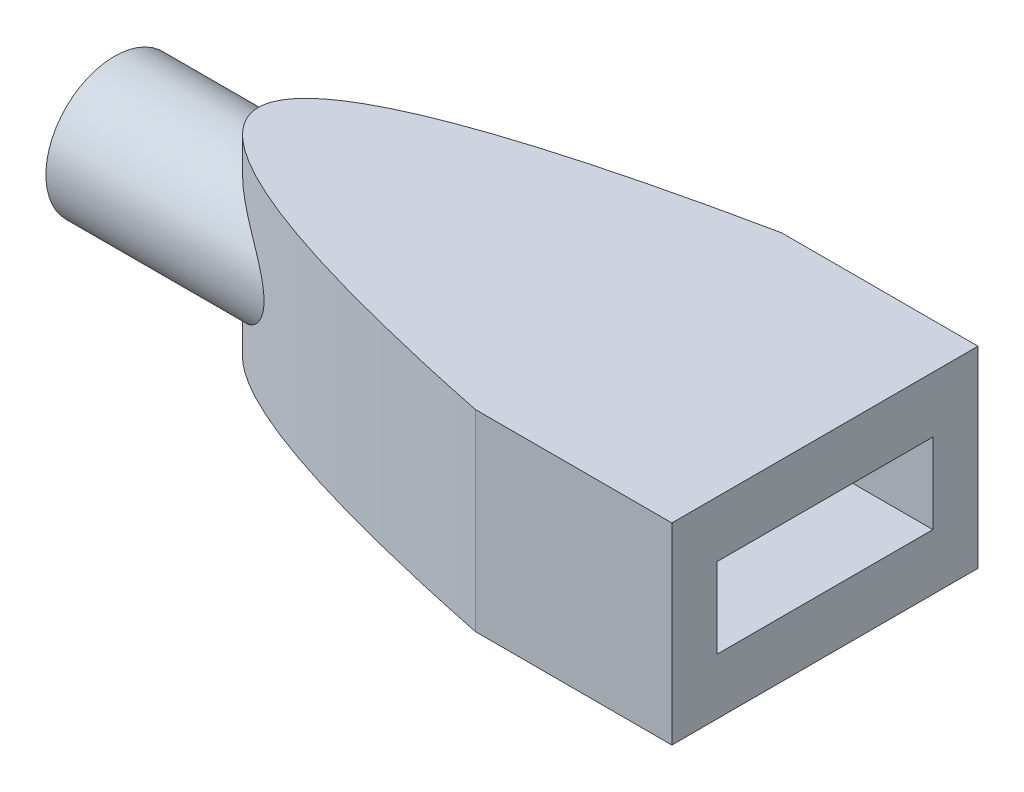
ISO-10303-21;
HEADER;
FILE_DESCRIPTION(('STEP AP214'),'2;1');
FILE_NAME('part.step','',(''),(''),'','','');
FILE_SCHEMA(('AUTOMOTIVE_DESIGN { 1 0 10303 214 1 1 1 1 }'));
ENDSEC;
DATA;
#1=APPLICATION_CONTEXT('core data for automotive mechanical design processes');
#2=APPLICATION_PROTOCOL_DEFINITION('international standard','automotive_design',2000,#1);
#3=PRODUCT_CONTEXT('',#1,'mechanical');
#4=PRODUCT('Part','Part','',(#3));
#5=PRODUCT_RELATED_PRODUCT_CATEGORY('part','',(#4));
#6=PRODUCT_DEFINITION_FORMATION('','',#4);
#7=PRODUCT_DEFINITION_CONTEXT('part definition',#1,'design');
#8=PRODUCT_DEFINITION('design','',#6,#7);
#9=PRODUCT_DEFINITION_SHAPE('','',#8);
#10=(LENGTH_UNIT() NAMED_UNIT(*) SI_UNIT(.MILLI.,.METRE.));
#11=(NAMED_UNIT(*) PLANE_ANGLE_UNIT() SI_UNIT($,.RADIAN.));
#12=(NAMED_UNIT(*) SI_UNIT($,.STERADIAN.) SOLID_ANGLE_UNIT());
#13=UNCERTAINTY_MEASURE_WITH_UNIT(LENGTH_MEASURE(1.E-05),#10,'distance_accuracy_value','');
#14=(GEOMETRIC_REPRESENTATION_CONTEXT(3) GLOBAL_UNCERTAINTY_ASSIGNED_CONTEXT((#13)) GLOBAL_UNIT_ASSIGNED_CONTEXT((#10,
#11,#12)) REPRESENTATION_CONTEXT('',''));
#15=CARTESIAN_POINT('',(0.,0.,0.));
#16=DIRECTION('',(0.,0.,1.));
#17=DIRECTION('',(1.,0.,0.));
#18=AXIS2_PLACEMENT_3D('',#15,#16,#17);
#19=CARTESIAN_POINT('',(5.461,5.3467,8.509));
#20=DIRECTION('',(-1.,0.,0.));
#21=DIRECTION('',(0.,0.,1.));
#22=AXIS2_PLACEMENT_3D('',#19,#20,#21);
#23=PLANE('',#22);
#24=DIRECTION('',(0.,0.,1.));
#25=VECTOR('',#24,1.);
#26=CARTESIAN_POINT('',(5.461,2.22885,6.00075));
#27=LINE('',#26,#25);
#28=CARTESIAN_POINT('',(5.461,2.22885,-6.00075));
#29=VERTEX_POINT('',#28);
#30=CARTESIAN_POINT('',(5.461,2.22885,6.00075));
#31=VERTEX_POINT('',#30);
#32=EDGE_CURVE('E143',#29,#31,#27,.T.);
#33=ORIENTED_EDGE('',*,*,#32,.F.);
#34=DIRECTION('',(0.,1.,0.));
#35=VECTOR('',#34,1.);
#36=CARTESIAN_POINT('',(5.461,-2.22885,-6.00075));
#37=LINE('',#36,#35);
#38=CARTESIAN_POINT('',(5.461,-2.22885,-6.00075));
#39=VERTEX_POINT('',#38);
#40=EDGE_CURVE('E59',#39,#29,#37,.T.);
#41=ORIENTED_EDGE('',*,*,#40,.F.);
#42=DIRECTION('',(0.,0.,-1.));
#43=VECTOR('',#42,1.);
#44=CARTESIAN_POINT('',(5.461,-2.22885,6.00075));
#45=LINE('',#44,#43);
#46=CARTESIAN_POINT('',(5.461,-2.22885,6.00075));
#47=VERTEX_POINT('',#46);
#48=EDGE_CURVE('E234',#47,#39,#45,.T.);
#49=ORIENTED_EDGE('',*,*,#48,.F.);
#50=DIRECTION('',(0.,-1.,0.));
#51=VECTOR('',#50,1.);
#52=CARTESIAN_POINT('',(5.461,-2.22885,6.00075));
#53=LINE('',#52,#51);
#54=EDGE_CURVE('E238',#31,#47,#53,.T.);
#55=ORIENTED_EDGE('',*,*,#54,.F.);
#56=EDGE_LOOP('',(#33,#41,#49,#55));
#57=FACE_BOUND('',#56,.T.);
#58=DIRECTION('',(0.,0.,-1.));
#59=VECTOR('',#58,1.);
#60=CARTESIAN_POINT('',(5.461,-5.3467,8.509));
#61=LINE('',#60,#59);
#62=CARTESIAN_POINT('',(5.461,-5.3467,8.509));
#63=VERTEX_POINT('',#62);
#64=CARTESIAN_POINT('',(5.461,-5.3467,-8.509));
#65=VERTEX_POINT('',#64);
#66=EDGE_CURVE('E123',#63,#65,#61,.T.);
#67=ORIENTED_EDGE('',*,*,#66,.T.);
#68=DIRECTION('',(0.,-1.,0.));
#69=VECTOR('',#68,1.);
#70=CARTESIAN_POINT('',(5.461,5.3467,-8.509));
#71=LINE('',#70,#69);
#72=CARTESIAN_POINT('',(5.461,5.3467,-8.509));
#73=VERTEX_POINT('',#72);
#74=EDGE_CURVE('E52',#73,#65,#71,.T.);
#75=ORIENTED_EDGE('',*,*,#74,.F.);
#76=DIRECTION('',(0.,0.,-1.));
#77=VECTOR('',#76,1.);
#78=CARTESIAN_POINT('',(5.461,5.3467,8.509));
#79=LINE('',#78,#77);
#80=CARTESIAN_POINT('',(5.461,5.3467,8.509));
#81=VERTEX_POINT('',#80);
#82=EDGE_CURVE('E125',#81,#73,#79,.T.);
#83=ORIENTED_EDGE('',*,*,#82,.F.);
#84=DIRECTION('',(0.,-1.,0.));
#85=VECTOR('',#84,1.);
#86=CARTESIAN_POINT('',(5.461,5.3467,8.509));
#87=LINE('',#86,#85);
#88=EDGE_CURVE('E135',#81,#63,#87,.T.);
#89=ORIENTED_EDGE('',*,*,#88,.T.);
#90=EDGE_LOOP('',(#67,#75,#83,#89));
#91=FACE_BOUND('',#90,.T.);
#92=ADVANCED_FACE('F39',(#57,#91),#23,.F.);
#93=CARTESIAN_POINT('',(-5.461,5.3467,-8.509));
#94=DIRECTION('',(0.,0.,1.));
#95=DIRECTION('',(1.,0.,0.));
#96=AXIS2_PLACEMENT_3D('',#93,#94,#95);
#97=PLANE('',#96);
#98=DIRECTION('',(-1.,0.,0.));
#99=VECTOR('',#98,1.);
#100=CARTESIAN_POINT('',(-5.461,-5.3467,-8.509));
#101=LINE('',#100,#99);
#102=CARTESIAN_POINT('',(-5.461,-5.3467,-8.509));
#103=VERTEX_POINT('',#102);
#104=EDGE_CURVE('E126',#65,#103,#101,.T.);
#105=ORIENTED_EDGE('',*,*,#104,.T.);
#106=DIRECTION('',(0.,-1.,0.));
#107=VECTOR('',#106,1.);
#108=CARTESIAN_POINT('',(-5.461,5.3467,-8.509));
#109=LINE('',#108,#107);
#110=CARTESIAN_POINT('',(-5.461,5.3467,-8.509));
#111=VERTEX_POINT('',#110);
#112=EDGE_CURVE('E134',#111,#103,#109,.T.);
#113=ORIENTED_EDGE('',*,*,#112,.F.);
#114=DIRECTION('',(-1.,0.,0.));
#115=VECTOR('',#114,1.);
#116=CARTESIAN_POINT('',(-5.461,5.3467,-8.509));
#117=LINE('',#116,#115);
#118=EDGE_CURVE('E94',#73,#111,#117,.T.);
#119=ORIENTED_EDGE('',*,*,#118,.F.);
#120=ORIENTED_EDGE('',*,*,#74,.T.);
#121=EDGE_LOOP('',(#105,#113,#119,#120));
#122=FACE_BOUND('',#121,.T.);
#123=ADVANCED_FACE('F197',(#122),#97,.F.);
#124=CARTESIAN_POINT('',(-5.461,5.3467,8.509));
#125=DIRECTION('',(0.,0.,-1.));
#126=DIRECTION('',(-1.,0.,0.));
#127=AXIS2_PLACEMENT_3D('',#124,#125,#126);
#128=PLANE('',#127);
#129=DIRECTION('',(1.,0.,0.));
#130=VECTOR('',#129,1.);
#131=CARTESIAN_POINT('',(-5.461,-5.3467,8.509));
#132=LINE('',#131,#130);
#133=CARTESIAN_POINT('',(-5.461,-5.3467,8.509));
#134=VERTEX_POINT('',#133);
#135=EDGE_CURVE('E86',#134,#63,#132,.T.);
#136=ORIENTED_EDGE('',*,*,#135,.T.);
#137=ORIENTED_EDGE('',*,*,#88,.F.);
#138=DIRECTION('',(1.,0.,0.));
#139=VECTOR('',#138,1.);
#140=CARTESIAN_POINT('',(-5.461,5.3467,8.509));
#141=LINE('',#140,#139);
#142=CARTESIAN_POINT('',(-5.461,5.3467,8.509));
#143=VERTEX_POINT('',#142);
#144=EDGE_CURVE('E68',#143,#81,#141,.T.);
#145=ORIENTED_EDGE('',*,*,#144,.F.);
#146=DIRECTION('',(0.,-1.,0.));
#147=VECTOR('',#146,1.);
#148=CARTESIAN_POINT('',(-5.461,5.3467,8.509));
#149=LINE('',#148,#147);
#150=EDGE_CURVE('E129',#143,#134,#149,.T.);
#151=ORIENTED_EDGE('',*,*,#150,.T.);
#152=EDGE_LOOP('',(#136,#137,#145,#151));
#153=FACE_BOUND('',#152,.T.);
#154=ADVANCED_FACE('F130',(#153),#128,.F.);
#155=CARTESIAN_POINT('',(0.,5.3467,0.));
#156=DIRECTION('',(0.,-1.,0.));
#157=DIRECTION('',(0.,0.,-1.));
#158=AXIS2_PLACEMENT_3D('',#155,#156,#157);
#159=PLANE('',#158);
#160=ORIENTED_EDGE('',*,*,#82,.T.);
#161=ORIENTED_EDGE('',*,*,#118,.T.);
#162=CARTESIAN_POINT('',(-5.461,5.3467,-8.509));
#163=CARTESIAN_POINT('',(-46.609,5.3467,0.));
#164=CARTESIAN_POINT('',(-5.461,5.3467,8.509));
#165=B_SPLINE_CURVE_WITH_KNOTS('',2,(#162,#163,#164),.UNSPECIFIED.,.F.,.F.,(3,3),(0.,1.),.UNSPECIFIED.);
#166=EDGE_CURVE('E139',#111,#143,#165,.T.);
#167=ORIENTED_EDGE('',*,*,#166,.T.);
#168=ORIENTED_EDGE('',*,*,#144,.T.);
#169=EDGE_LOOP('',(#160,#161,#167,#168));
#170=FACE_BOUND('',#169,.T.);
#171=ADVANCED_FACE('F191',(#170),#159,.F.);
#172=CARTESIAN_POINT('',(0.,-5.3467,0.));
#173=DIRECTION('',(0.,-1.,0.));
#174=DIRECTION('',(0.,0.,-1.));
#175=AXIS2_PLACEMENT_3D('',#172,#173,#174);
#176=PLANE('',#175);
#177=ORIENTED_EDGE('',*,*,#66,.F.);
#178=ORIENTED_EDGE('',*,*,#135,.F.);
#179=CARTESIAN_POINT('',(-5.461,-5.3467,-8.509));
#180=CARTESIAN_POINT('',(-46.609,-5.3467,0.));
#181=CARTESIAN_POINT('',(-5.461,-5.3467,8.509));
#182=B_SPLINE_CURVE_WITH_KNOTS('',2,(#179,#180,#181),.UNSPECIFIED.,.F.,.F.,(3,3),(0.,1.),.UNSPECIFIED.);
#183=EDGE_CURVE('E120',#103,#134,#182,.T.);
#184=ORIENTED_EDGE('',*,*,#183,.F.);
#185=ORIENTED_EDGE('',*,*,#104,.F.);
#186=EDGE_LOOP('',(#177,#178,#184,#185));
#187=FACE_BOUND('',#186,.T.);
#188=ADVANCED_FACE('F118',(#187),#176,.T.);
#189=CARTESIAN_POINT('',(-4.2926,-2.22885,-6.00075));
#190=DIRECTION('',(0.,0.,-1.));
#191=DIRECTION('',(-1.,0.,0.));
#192=AXIS2_PLACEMENT_3D('',#189,#190,#191);
#193=PLANE('',#192);
#194=ORIENTED_EDGE('',*,*,#40,.T.);
#195=DIRECTION('',(1.,0.,0.));
#196=VECTOR('',#195,1.);
#197=CARTESIAN_POINT('',(-4.2926,2.22885,-6.00075));
#198=LINE('',#197,#196);
#199=CARTESIAN_POINT('',(-4.2926,2.22885,-6.00075));
#200=VERTEX_POINT('',#199);
#201=EDGE_CURVE('E222',#200,#29,#198,.T.);
#202=ORIENTED_EDGE('',*,*,#201,.F.);
#203=DIRECTION('',(0.,1.,0.));
#204=VECTOR('',#203,1.);
#205=CARTESIAN_POINT('',(-4.2926,-2.22885,-6.00075));
#206=LINE('',#205,#204);
#207=CARTESIAN_POINT('',(-4.2926,-2.22885,-6.00075));
#208=VERTEX_POINT('',#207);
#209=EDGE_CURVE('E160',#208,#200,#206,.T.);
#210=ORIENTED_EDGE('',*,*,#209,.F.);
#211=DIRECTION('',(1.,0.,0.));
#212=VECTOR('',#211,1.);
#213=CARTESIAN_POINT('',(-4.2926,-2.22885,-6.00075));
#214=LINE('',#213,#212);
#215=EDGE_CURVE('E207',#208,#39,#214,.T.);
#216=ORIENTED_EDGE('',*,*,#215,.T.);
#217=EDGE_LOOP('',(#194,#202,#210,#216));
#218=FACE_BOUND('',#217,.T.);
#219=ADVANCED_FACE('F181',(#218),#193,.F.);
#220=CARTESIAN_POINT('',(-4.2926,-2.22885,6.00075));
#221=DIRECTION('',(0.,-1.,0.));
#222=DIRECTION('',(0.,0.,-1.));
#223=AXIS2_PLACEMENT_3D('',#220,#221,#222);
#224=PLANE('',#223);
#225=ORIENTED_EDGE('',*,*,#48,.T.);
#226=ORIENTED_EDGE('',*,*,#215,.F.);
#227=DIRECTION('',(0.,0.,-1.));
#228=VECTOR('',#227,1.);
#229=CARTESIAN_POINT('',(-4.2926,-2.22885,6.00075));
#230=LINE('',#229,#228);
#231=CARTESIAN_POINT('',(-4.2926,-2.22885,6.00075));
#232=VERTEX_POINT('',#231);
#233=EDGE_CURVE('E226',#232,#208,#230,.T.);
#234=ORIENTED_EDGE('',*,*,#233,.F.);
#235=DIRECTION('',(1.,0.,0.));
#236=VECTOR('',#235,1.);
#237=CARTESIAN_POINT('',(-4.2926,-2.22885,6.00075));
#238=LINE('',#237,#236);
#239=EDGE_CURVE('E229',#232,#47,#238,.T.);
#240=ORIENTED_EDGE('',*,*,#239,.T.);
#241=EDGE_LOOP('',(#225,#226,#234,#240));
#242=FACE_BOUND('',#241,.T.);
#243=ADVANCED_FACE('F177',(#242),#224,.F.);
#244=CARTESIAN_POINT('',(-4.2926,-2.22885,6.00075));
#245=DIRECTION('',(0.,0.,1.));
#246=DIRECTION('',(1.,0.,0.));
#247=AXIS2_PLACEMENT_3D('',#244,#245,#246);
#248=PLANE('',#247);
#249=ORIENTED_EDGE('',*,*,#54,.T.);
#250=ORIENTED_EDGE('',*,*,#239,.F.);
#251=DIRECTION('',(0.,-1.,0.));
#252=VECTOR('',#251,1.);
#253=CARTESIAN_POINT('',(-4.2926,-2.22885,6.00075));
#254=LINE('',#253,#252);
#255=CARTESIAN_POINT('',(-4.2926,2.22885,6.00075));
#256=VERTEX_POINT('',#255);
#257=EDGE_CURVE('E248',#256,#232,#254,.T.);
#258=ORIENTED_EDGE('',*,*,#257,.F.);
#259=DIRECTION('',(1.,0.,0.));
#260=VECTOR('',#259,1.);
#261=CARTESIAN_POINT('',(-4.2926,2.22885,6.00075));
#262=LINE('',#261,#260);
#263=EDGE_CURVE('E225',#256,#31,#262,.T.);
#264=ORIENTED_EDGE('',*,*,#263,.T.);
#265=EDGE_LOOP('',(#249,#250,#258,#264));
#266=FACE_BOUND('',#265,.T.);
#267=ADVANCED_FACE('F180',(#266),#248,.F.);
#268=CARTESIAN_POINT('',(-4.2926,2.22885,6.00075));
#269=DIRECTION('',(0.,1.,0.));
#270=DIRECTION('',(0.,0.,1.));
#271=AXIS2_PLACEMENT_3D('',#268,#269,#270);
#272=PLANE('',#271);
#273=ORIENTED_EDGE('',*,*,#32,.T.);
#274=ORIENTED_EDGE('',*,*,#263,.F.);
#275=DIRECTION('',(0.,0.,1.));
#276=VECTOR('',#275,1.);
#277=CARTESIAN_POINT('',(-4.2926,2.22885,6.00075));
#278=LINE('',#277,#276);
#279=EDGE_CURVE('E251',#200,#256,#278,.T.);
#280=ORIENTED_EDGE('',*,*,#279,.F.);
#281=ORIENTED_EDGE('',*,*,#201,.T.);
#282=EDGE_LOOP('',(#273,#274,#280,#281));
#283=FACE_BOUND('',#282,.T.);
#284=ADVANCED_FACE('F175',(#283),#272,.F.);
#285=CARTESIAN_POINT('',(-4.2926,0.,0.));
#286=DIRECTION('',(-1.,0.,0.));
#287=DIRECTION('',(0.,0.,1.));
#288=AXIS2_PLACEMENT_3D('',#285,#286,#287);
#289=PLANE('',#288);
#290=ORIENTED_EDGE('',*,*,#209,.T.);
#291=ORIENTED_EDGE('',*,*,#279,.T.);
#292=ORIENTED_EDGE('',*,*,#257,.T.);
#293=ORIENTED_EDGE('',*,*,#233,.T.);
#294=EDGE_LOOP('',(#290,#291,#292,#293));
#295=FACE_BOUND('',#294,.T.);
#296=ADVANCED_FACE('F169',(#295),#289,.F.);
#297=CARTESIAN_POINT('',(-5.461,-32.0469209728684,-8.509));
#298=CARTESIAN_POINT('',(-46.609,-32.0469209728684,0.));
#299=CARTESIAN_POINT('',(-5.461,-32.0469209728684,8.509));
#300=B_SPLINE_CURVE_WITH_KNOTS('',2,(#297,#298,#299),.UNSPECIFIED.,.F.,.F.,(3,3),(0.,1.),.UNSPECIFIED.);
#301=DIRECTION('',(0.,1.,0.));
#302=VECTOR('',#301,1.);
#303=SURFACE_OF_LINEAR_EXTRUSION('',#300,#302);
#304=CARTESIAN_POINT('',(-21.9101169525507,0.,-3.81));
#305=CARTESIAN_POINT('',(-21.9101162760935,-0.050344521565705,-3.8100002822212));
#306=CARTESIAN_POINT('',(-21.9122837770813,-0.100685125142597,-3.8089996784871));
#307=CARTESIAN_POINT('',(-21.9208761911947,-0.200939843045162,-3.80502832111581));
#308=CARTESIAN_POINT('',(-21.9273026504904,-0.250853795811463,-3.80205685197632));
#309=CARTESIAN_POINT('',(-21.944205700197,-0.349883565606855,-3.79422609603951));
#310=CARTESIAN_POINT('',(-21.9546861708058,-0.398998570868929,-3.78936500061052));
#311=CARTESIAN_POINT('',(-21.9793794796897,-0.496089670319657,-3.77788133097259));
#312=CARTESIAN_POINT('',(-21.9935944499687,-0.544065096814944,-3.77125775054349));
#313=CARTESIAN_POINT('',(-22.0299212272782,-0.652154866985758,-3.7542750973826));
#314=CARTESIAN_POINT('',(-22.0531288282878,-0.711818478397186,-3.74338945028756));
#315=CARTESIAN_POINT('',(-22.1042563539067,-0.828627806113224,-3.71927932520808));
#316=CARTESIAN_POINT('',(-22.1321801623835,-0.8857713978303,-3.70605291914051));
#317=CARTESIAN_POINT('',(-22.1919744139415,-0.997510106169924,-3.67755397618924));
#318=CARTESIAN_POINT('',(-22.2238501923162,-1.05210163753692,-3.66227867089477));
#319=CARTESIAN_POINT('',(-22.2908130283212,-1.15869185204907,-3.62996324413385));
#320=CARTESIAN_POINT('',(-22.3258993557662,-1.21069112062535,-3.61292352383848));
#321=CARTESIAN_POINT('',(-22.427332677773,-1.35218542988389,-3.56327779448679));
#322=CARTESIAN_POINT('',(-22.4965684897623,-1.43901633072767,-3.52896651181544));
#323=CARTESIAN_POINT('',(-22.6409015859383,-1.60583419468994,-3.45625254576965));
#324=CARTESIAN_POINT('',(-22.7160039338387,-1.68581511758729,-3.41784631716282));
#325=CARTESIAN_POINT('',(-22.8705478494639,-1.84007348424934,-3.33733759134451));
#326=CARTESIAN_POINT('',(-22.9500036744081,-1.9143300025693,-3.29522263669812));
#327=CARTESIAN_POINT('',(-23.1117506910859,-2.05763586194549,-3.20769110827921));
#328=CARTESIAN_POINT('',(-23.1940426533911,-2.12668377132512,-3.16227363344025));
#329=CARTESIAN_POINT('',(-23.383825041197,-2.27892987514588,-3.05508089397387));
#330=CARTESIAN_POINT('',(-23.4919116122629,-2.36066771794722,-2.99228954063655));
#331=CARTESIAN_POINT('',(-23.7096425327289,-2.51773114377772,-2.8613951572815));
#332=CARTESIAN_POINT('',(-23.8192880008465,-2.5930518192372,-2.79328813700018));
#333=CARTESIAN_POINT('',(-24.0388764996502,-2.73800828217595,-2.65136044766942));
#334=CARTESIAN_POINT('',(-24.148819728325,-2.80763732458862,-2.5775331957518));
#335=CARTESIAN_POINT('',(-24.3675757875864,-2.94153955996287,-2.42360319011055));
#336=CARTESIAN_POINT('',(-24.4763886690568,-3.00581299493521,-2.34350072027103));
#337=CARTESIAN_POINT('',(-24.6912964989779,-3.12908818158328,-2.17616603283626));
#338=CARTESIAN_POINT('',(-24.7973941926646,-3.18809542113442,-2.08894142313682));
#339=CARTESIAN_POINT('',(-25.0049524093434,-3.30066066276324,-1.90611107593211));
#340=CARTESIAN_POINT('',(-25.1064196597756,-3.35422671863168,-1.81051812719561));
#341=CARTESIAN_POINT('',(-25.2717596044297,-3.4396740709633,-1.64035762909191));
#342=CARTESIAN_POINT('',(-25.3375429431441,-3.47313328386464,-1.56844760309774));
#343=CARTESIAN_POINT('',(-25.4642856711012,-3.53676103655391,-1.41915705915763));
#344=CARTESIAN_POINT('',(-25.5252480546061,-3.56693162336179,-1.34177999421121));
#345=CARTESIAN_POINT('',(-25.6401479778817,-3.62316699410171,-1.18148819972146));
#346=CARTESIAN_POINT('',(-25.6941363657592,-3.64926182605026,-1.09862110893121));
#347=CARTESIAN_POINT('',(-25.7931627875131,-3.69670111943966,-0.926527879809284));
#348=CARTESIAN_POINT('',(-25.8382160560152,-3.71805367417844,-0.837312923993255));
#349=CARTESIAN_POINT('',(-25.9145837422646,-3.75401749466922,-0.656867746402445));
#350=CARTESIAN_POINT('',(-25.9464480742346,-3.76890028189092,-0.565933400561934));
#351=CARTESIAN_POINT('',(-25.9839988675125,-3.78637720581065,-0.426217485892037));
#352=CARTESIAN_POINT('',(-25.9948094174981,-3.79139553496074,-0.379082500380973));
#353=CARTESIAN_POINT('',(-26.0127267406945,-3.79970189572854,-0.283970892315849));
#354=CARTESIAN_POINT('',(-26.0198350913417,-3.80299066428485,-0.235994637232414));
#355=CARTESIAN_POINT('',(-26.0301605531215,-3.80776509135317,-0.139234522643702));
#356=CARTESIAN_POINT('',(-26.0333534523889,-3.80923953084116,-0.0904475103037804));
#357=CARTESIAN_POINT('',(-26.0356629364409,-3.81030619321603,0.00724318935845688));
#358=CARTESIAN_POINT('',(-26.0347796445414,-3.80989847304336,0.0561468731064111));
#359=CARTESIAN_POINT('',(-26.0289656546251,-3.80721236276947,0.153668557868589));
#360=CARTESIAN_POINT('',(-26.0240342046088,-3.80493362510167,0.202286504113071));
#361=CARTESIAN_POINT('',(-26.0102818928486,-3.7985685732481,0.298866487964077));
#362=CARTESIAN_POINT('',(-26.0014591110604,-3.79448136673211,0.346828189709231));
#363=CARTESIAN_POINT('',(-25.978579086557,-3.7838576083384,0.448929287407729));
#364=CARTESIAN_POINT('',(-25.9639326313883,-3.77704440853271,0.502908014433058));
#365=CARTESIAN_POINT('',(-25.9303402160591,-3.76136245656366,0.609216952992709));
#366=CARTESIAN_POINT('',(-25.9113913817624,-3.75249233021824,0.661546035773434));
#367=CARTESIAN_POINT('',(-25.8488822870251,-3.72310432739419,0.815813646815693));
#368=CARTESIAN_POINT('',(-25.7996749129881,-3.69981592503638,0.914968442352901));
#369=CARTESIAN_POINT('',(-25.700662297701,-3.65239197475384,1.08747193702961));
#370=CARTESIAN_POINT('',(-25.6526792292398,-3.62922400353855,1.16218516081856));
#371=CARTESIAN_POINT('',(-25.5512517956624,-3.57971067837156,1.30675403334819));
#372=CARTESIAN_POINT('',(-25.4978036297101,-3.55336311076461,1.37660624385205));
#373=CARTESIAN_POINT('',(-25.3866825067659,-3.49790539478754,1.51199419864569));
#374=CARTESIAN_POINT('',(-25.3289986825151,-3.46878807939107,1.5775179579745));
#375=CARTESIAN_POINT('',(-25.2105224835345,-3.40816019717608,1.70455187705475));
#376=CARTESIAN_POINT('',(-25.1497288835344,-3.37664868461897,1.76606043272508));
#377=CARTESIAN_POINT('',(-25.0238777713938,-3.3104283613515,1.8873496534668));
#378=CARTESIAN_POINT('',(-24.9587462917817,-3.27565016777049,1.94701515671872));
#379=CARTESIAN_POINT('',(-24.8266609503775,-3.20391239846032,2.0629310958078));
#380=CARTESIAN_POINT('',(-24.7597066960178,-3.16695235079434,2.11918078742491));
#381=CARTESIAN_POINT('',(-24.5567925148869,-3.0528442350621,2.28343607079223));
#382=CARTESIAN_POINT('',(-24.4188829130504,-2.97252107863323,2.38685266406815));
#383=CARTESIAN_POINT('',(-24.1411677130853,-2.80331591586629,2.58346996302735));
#384=CARTESIAN_POINT('',(-24.0013622899952,-2.71443469512113,2.67667160472227));
#385=CARTESIAN_POINT('',(-23.7225168073571,-2.52723103759514,2.85409148271779));
#386=CARTESIAN_POINT('',(-23.5834762285552,-2.42891614776898,2.93831678810108));
#387=CARTESIAN_POINT('',(-23.3738148317157,-2.27023445811238,3.06053851567699));
#388=CARTESIAN_POINT('',(-23.3019052436409,-2.21388475674422,3.10157537791655));
#389=CARTESIAN_POINT('',(-23.1595906074709,-2.09772941651424,3.18128887491722));
#390=CARTESIAN_POINT('',(-23.0891853133717,-2.03792434874198,3.21996589754326));
#391=CARTESIAN_POINT('',(-22.9505213438311,-1.91445901476471,3.29486838653523));
#392=CARTESIAN_POINT('',(-22.8822619140013,-1.85080012694458,3.33109471973024));
#393=CARTESIAN_POINT('',(-22.7486741147775,-1.71911309384183,3.40092723472376));
#394=CARTESIAN_POINT('',(-22.6833451429065,-1.65108585371267,3.43453395614973));
#395=CARTESIAN_POINT('',(-22.570716536588,-1.52570000564231,3.49170081548703));
#396=CARTESIAN_POINT('',(-22.5226282220049,-1.46931520807602,3.51583761365771));
#397=CARTESIAN_POINT('',(-22.4295271138368,-1.35323902343374,3.56212732071881));
#398=CARTESIAN_POINT('',(-22.3845151177236,-1.2935467861794,3.58427971565272));
#399=CARTESIAN_POINT('',(-22.2985125397071,-1.17071958618794,3.62625364041113));
#400=CARTESIAN_POINT('',(-22.2575137740709,-1.10759205598491,3.64607993072925));
#401=CARTESIAN_POINT('',(-22.1805046061489,-0.977631626873983,3.68305659345547));
#402=CARTESIAN_POINT('',(-22.1444930502246,-0.910799589915962,3.70020758482863));
#403=CARTESIAN_POINT('',(-22.0690857226914,-0.753193498436891,3.73591631406606));
#404=CARTESIAN_POINT('',(-22.0317773731591,-0.661131125460415,3.75341996002422));
#405=CARTESIAN_POINT('',(-21.9860487287416,-0.519098959222633,3.77477612512331));
#406=CARTESIAN_POINT('',(-21.9725129535002,-0.471107127293402,3.78107762836984));
#407=CARTESIAN_POINT('',(-21.949202163885,-0.374029605410818,3.79191015102387));
#408=CARTESIAN_POINT('',(-21.9394254399618,-0.324944423464179,3.79644197526444));
#409=CARTESIAN_POINT('',(-21.9238659718579,-0.225557358946293,3.80364670718959));
#410=CARTESIAN_POINT('',(-21.9181194113546,-0.175248547117379,3.80630277537696));
#411=CARTESIAN_POINT('',(-21.9109592882067,-0.0742557480185953,3.80961132647028));
#412=CARTESIAN_POINT('',(-21.9095456581985,-0.02357176659373,3.81026384052529));
#413=CARTESIAN_POINT('',(-21.9111048986047,0.0777245402996789,3.80954373425964));
#414=CARTESIAN_POINT('',(-21.9140785234247,0.128336851946287,3.80817076564939));
#415=CARTESIAN_POINT('',(-21.9242994971574,0.229019951028899,3.80344510190608));
#416=CARTESIAN_POINT('',(-21.9315467833806,0.279090746397341,3.80009243581287));
#417=CARTESIAN_POINT('',(-21.9574637106491,0.417761017651418,3.78807878791192));
#418=CARTESIAN_POINT('',(-21.9806337176163,0.50537033526637,3.77731665124831));
#419=CARTESIAN_POINT('',(-22.0378859821264,0.675983403852157,3.75055179716433));
#420=CARTESIAN_POINT('',(-22.0719735831041,0.758984876200783,3.73454651348515));
#421=CARTESIAN_POINT('',(-22.1769595562472,0.979071252914712,3.68483704814956));
#422=CARTESIAN_POINT('',(-22.2564967515207,1.11105718503504,3.64677155990559));
#423=CARTESIAN_POINT('',(-22.3877084152616,1.29792766823283,3.58271493863425));
#424=CARTESIAN_POINT('',(-22.433533849019,1.35847658868496,3.56015073237406));
#425=CARTESIAN_POINT('',(-22.5283652231319,1.47620007998657,3.5129679708256));
#426=CARTESIAN_POINT('',(-22.5773704494775,1.53337540289636,3.48834987637749));
#427=CARTESIAN_POINT('',(-22.7270908296028,1.69918870510417,3.41227135690812));
#428=CARTESIAN_POINT('',(-22.8314113214589,1.80334101975791,3.35815145250652));
#429=CARTESIAN_POINT('',(-23.0459757647671,2.00177119446252,3.24378167416173));
#430=CARTESIAN_POINT('',(-23.1562259032058,2.09603842570966,3.18352533653474));
#431=CARTESIAN_POINT('',(-23.3806796791537,2.27669228383869,3.05695752715095));
#432=CARTESIAN_POINT('',(-23.4948998986513,2.36303846971462,2.99061810371016));
#433=CARTESIAN_POINT('',(-23.7248903187703,2.52849774922606,2.85209303255539));
#434=CARTESIAN_POINT('',(-23.8406596965699,2.60761452052325,2.77991039297701));
#435=CARTESIAN_POINT('',(-24.0457982177585,2.74211869784209,2.64644735845393));
#436=CARTESIAN_POINT('',(-24.1351560495401,2.79879778103817,2.58644393994458));
#437=CARTESIAN_POINT('',(-24.313246126982,2.90860764891849,2.46231068480679));
#438=CARTESIAN_POINT('',(-24.4019781631353,2.96173729145421,2.398179532855));
#439=CARTESIAN_POINT('',(-24.5781151553494,3.06459518362934,2.26526521434794));
#440=CARTESIAN_POINT('',(-24.6655185410488,3.11431962003729,2.19647699867214));
#441=CARTESIAN_POINT('',(-24.8372971137487,3.20990083786133,2.05424482616227));
#442=CARTESIAN_POINT('',(-24.9216907059829,3.25578495331773,1.98084172474089));
#443=CARTESIAN_POINT('',(-25.0869094752133,3.34388411745552,1.8281959696326));
#444=CARTESIAN_POINT('',(-25.1677378655424,3.38610250475512,1.7489587536508));
#445=CARTESIAN_POINT('',(-25.3241805576844,3.4664426294552,1.58376163585209));
#446=CARTESIAN_POINT('',(-25.3998041454691,3.50457173426362,1.49781432312051));
#447=CARTESIAN_POINT('',(-25.5063821079012,3.55754268634946,1.36460866456238));
#448=CARTESIAN_POINT('',(-25.5401912863544,3.57422012245862,1.32035953430175));
#449=CARTESIAN_POINT('',(-25.6057283101674,3.6063395291503,1.22992732987669));
#450=CARTESIAN_POINT('',(-25.6374561797795,3.62178151412929,1.18374427825742));
#451=CARTESIAN_POINT('',(-25.7290020119223,3.66607625334267,1.04200858237917));
#452=CARTESIAN_POINT('',(-25.7851559404911,3.69288481898241,0.943301324102059));
#453=CARTESIAN_POINT('',(-25.8591957932495,3.7279429386339,0.788291240159787));
#454=CARTESIAN_POINT('',(-25.8823083949802,3.73883029978856,0.735045741486566));
#455=CARTESIAN_POINT('',(-25.9242849621131,3.75853342017061,0.62654790385147));
#456=CARTESIAN_POINT('',(-25.9431516499351,3.76735050698663,0.571296877352586));
#457=CARTESIAN_POINT('',(-25.9759835942724,3.78265394893993,0.459155806098011));
#458=CARTESIAN_POINT('',(-25.9899588708473,3.78914506947789,0.402269373411383));
#459=CARTESIAN_POINT('',(-26.0125006299028,3.79959851034666,0.287202077069643));
#460=CARTESIAN_POINT('',(-26.021068253042,3.80356136397705,0.229021489078234));
#461=CARTESIAN_POINT('',(-26.0318239424957,3.80853362329459,0.118032201859741));
#462=CARTESIAN_POINT('',(-26.0345800132796,3.80980602767899,0.0652900321235934));
#463=CARTESIAN_POINT('',(-26.0353307809954,3.81015277421513,-0.0402329456285952));
#464=CARTESIAN_POINT('',(-26.0333259012927,3.80922731181128,-0.0930137497918401));
#465=CARTESIAN_POINT('',(-26.0246297602138,3.80520820424344,-0.198142178338153));
#466=CARTESIAN_POINT('',(-26.0179348001439,3.80211284785515,-0.250489427821996));
#467=CARTESIAN_POINT('',(-26.0001048061072,3.79385231212325,-0.354252904734767));
#468=CARTESIAN_POINT('',(-25.9889692074237,3.78868686952605,-0.405669012880592));
#469=CARTESIAN_POINT('',(-25.9612114399945,3.77577443471953,-0.512674820788678));
#470=CARTESIAN_POINT('',(-25.9441277447695,3.76780942596648,-0.568118099642901));
#471=CARTESIAN_POINT('',(-25.9055638953194,3.74975678703698,-0.677112095638207));
#472=CARTESIAN_POINT('',(-25.8840807456944,3.73966771054189,-0.730661494031441));
#473=CARTESIAN_POINT('',(-25.8139343745537,3.70656458602364,-0.888260172979548));
#474=CARTESIAN_POINT('',(-25.7595873168964,3.68072065570243,-0.989213035256288));
#475=CARTESIAN_POINT('',(-25.6498377046736,3.62784213375888,-1.16707152161546));
#476=CARTESIAN_POINT('',(-25.5959954244556,3.60165970906208,-1.24524026121555));
#477=CARTESIAN_POINT('',(-25.4827033817188,3.54587946472247,-1.39617673570096));
#478=CARTESIAN_POINT('',(-25.423249445886,3.51627909948989,-1.4689403778713));
#479=CARTESIAN_POINT('',(-25.3000534528652,3.45408173540241,-1.609771999857));
#480=CARTESIAN_POINT('',(-25.2362985290695,3.42147562751046,-1.67782453353513));
#481=CARTESIAN_POINT('',(-25.1057274050268,3.35365427541475,-1.80958350101989));
#482=CARTESIAN_POINT('',(-25.0389100139457,3.31843801291595,-1.87328821980587));
#483=CARTESIAN_POINT('',(-24.9009076259017,3.24445163076451,-1.99877644690384));
#484=CARTESIAN_POINT('',(-24.829651330432,3.20560434386183,-2.06043549342979));
#485=CARTESIAN_POINT('',(-24.6854585388575,3.12545360202139,-2.18009575669932));
#486=CARTESIAN_POINT('',(-24.6125216973229,3.08414963931389,-2.2380962121092));
#487=CARTESIAN_POINT('',(-24.3919051774132,2.95652747701735,-2.40729774121127));
#488=CARTESIAN_POINT('',(-24.2425432319049,2.86656440370464,-2.51358975941895));
#489=CARTESIAN_POINT('',(-23.9432879942418,2.67657742352885,-2.71498354972463));
#490=CARTESIAN_POINT('',(-23.7933962983282,2.57657340408888,-2.81010666276808));
#491=CARTESIAN_POINT('',(-23.4961414651747,2.36488703439762,-2.99044233757285));
#492=CARTESIAN_POINT('',(-23.3487757556973,2.25321750098216,-3.07566556323986));
#493=CARTESIAN_POINT('',(-23.0873700983143,2.03771350242708,-3.221400228897));
#494=CARTESIAN_POINT('',(-22.9722546592948,1.93632382378151,-3.28355155095961));
#495=CARTESIAN_POINT('',(-22.8050623924462,1.77547554606053,-3.37157424847949));
#496=CARTESIAN_POINT('',(-22.7501987246887,1.72034583257886,-3.40007081100261));
#497=CARTESIAN_POINT('',(-22.6429070398095,1.60686885809926,-3.45514927297277));
#498=CARTESIAN_POINT('',(-22.5904784602762,1.54852234693497,-3.48173161531961));
#499=CARTESIAN_POINT('',(-22.4880152853035,1.42738451178086,-3.53313680813543));
#500=CARTESIAN_POINT('',(-22.4380253133764,1.3645417953652,-3.55792927669214));
#501=CARTESIAN_POINT('',(-22.342241701669,1.23488301478416,-3.6049884714468));
#502=CARTESIAN_POINT('',(-22.2964490932497,1.16806598067874,-3.62725457719396));
#503=CARTESIAN_POINT('',(-22.1674245950863,0.961426547064938,-3.68948507787125));
#504=CARTESIAN_POINT('',(-22.0920027688133,0.814809100623901,-3.72515093346494));
#505=CARTESIAN_POINT('',(-22.0143816800889,0.60800732772167,-3.76155061603154));
#506=CARTESIAN_POINT('',(-21.9967385774282,0.554762686250469,-3.76979001721418));
#507=CARTESIAN_POINT('',(-21.9659945631817,0.446713030666963,-3.78411270921872));
#508=CARTESIAN_POINT('',(-21.9528899778362,0.391909317637934,-3.79019774400884));
#509=CARTESIAN_POINT('',(-21.9317229337803,0.281232070486113,-3.80001178412593));
#510=CARTESIAN_POINT('',(-21.9236508838137,0.225360781855174,-3.80374527128967));
#511=CARTESIAN_POINT('',(-21.9128485953724,0.112991299960792,-3.80873907150642));
#512=CARTESIAN_POINT('',(-21.9101177116247,0.056493183254724,-3.80999968331064));
#513=CARTESIAN_POINT('',(-21.9101169525507,0.,-3.81));
#514=B_SPLINE_CURVE_WITH_KNOTS('',3,(#304,#305,#306,#307,#308,#309,#310,#311,#312,#313,#314,
#315,#316,#317,#318,#319,#320,#321,#322,#323,#324,#325,#326,#327,#328,#329,#330,#331,#332,#333,
#334,#335,#336,#337,#338,#339,#340,#341,#342,#343,#344,#345,#346,#347,#348,#349,#350,#351,#352,
#353,#354,#355,#356,#357,#358,#359,#360,#361,#362,#363,#364,#365,#366,#367,#368,#369,#370,#371,
#372,#373,#374,#375,#376,#377,#378,#379,#380,#381,#382,#383,#384,#385,#386,#387,#388,#389,#390,
#391,#392,#393,#394,#395,#396,#397,#398,#399,#400,#401,#402,#403,#404,#405,#406,#407,#408,#409,
#410,#411,#412,#413,#414,#415,#416,#417,#418,#419,#420,#421,#422,#423,#424,#425,#426,#427,#428,
#429,#430,#431,#432,#433,#434,#435,#436,#437,#438,#439,#440,#441,#442,#443,#444,#445,#446,#447,
#448,#449,#450,#451,#452,#453,#454,#455,#456,#457,#458,#459,#460,#461,#462,#463,#464,#465,#466,
#467,#468,#469,#470,#471,#472,#473,#474,#475,#476,#477,#478,#479,#480,#481,#482,#483,#484,#485,
#486,#487,#488,#489,#490,#491,#492,#493,#494,#495,#496,#497,#498,#499,#500,#501,#502,#503,#504,
#505,#506,#507,#508,#509,#510,#511,#512,#513),.UNSPECIFIED.,.T.,.F.,(4,2,2,2,2,2,2,2,2,2,2,2,2,
2,2,2,2,2,2,2,2,2,2,2,2,2,2,2,2,2,2,2,2,2,2,2,2,2,2,2,2,2,2,2,2,2,2,2,2,2,2,2,2,2,2,2,2,2,2,2,2,
2,2,2,2,2,2,2,2,2,2,2,2,2,2,2,2,2,2,2,2,2,2,2,2,2,2,2,2,2,2,2,2,2,2,2,2,2,2,2,2,2,2,2,4),(0.,
0.150971304081119,0.30199744675411,0.453168499514966,0.604426043190267,0.798926085206572,
0.993587088963888,1.18851381331785,1.38339631453406,1.73150435286854,2.07991625404812,
2.42954667908412,2.7792728585619,3.22705169278087,3.67516995110939,4.12381179225075,
4.57243334902532,5.02058180331372,5.46805695529669,5.77694461298513,6.08563889079344,
6.39193737966698,6.69770904436556,6.98898982622407,7.13469362418911,7.28033528965129,
7.42687308647092,7.57340645015401,7.71996704053374,7.86660002725952,8.03537328850225,
8.20425962951387,8.54222873548706,8.81718216643584,9.09232813819392,9.36820652142213,
9.64419445245494,9.92886128638524,10.2135899212149,10.7834928176935,11.3533434493611,
11.9227419410439,12.2231187368782,12.5234460288317,12.8236665310365,13.1238250249191,
13.3575085444375,13.591252413587,13.8245092461553,14.0577120314323,14.3590777014377,
14.5097083374012,14.6602703879869,14.8121674858904,14.9640622222526,15.1159830805473,
15.2679017103962,15.5405011562666,15.8132342258107,16.2864695527615,16.5240417031649,
16.7615606910572,17.2318791985995,17.702698333432,18.1758010842054,18.6486618080963,
19.013488389269,19.3784318054321,19.7437774282014,20.1062506970432,20.4683902970271,
20.8298660861429,21.0041809137339,21.1784937097736,21.5272486345191,21.7042452727772,
21.8811280978995,22.0576464280211,22.2341275119545,22.3923620010247,22.5505824196852,
22.7089277548898,22.8672932333195,23.0427038000904,23.2182341958516,23.5694403309777,
23.8644513870514,24.159683594041,24.4558419326722,24.7521164254374,25.0577600925452,
25.3634671540953,25.9754120926359,26.5861680462311,27.1962598858651,27.6921751855531,
27.9405755087836,28.1889181728612,28.4407909629066,28.6927254772433,29.1940449448287,
29.3639374690716,29.533692148479,29.7031223039665,29.8725319891202),.UNSPECIFIED.);
#515=CARTESIAN_POINT('',(-21.9101169525507,0.,-3.81));
#516=VERTEX_POINT('',#515);
#517=EDGE_CURVE('E11',#516,#516,#514,.T.);
#518=ORIENTED_EDGE('',*,*,#517,.F.);
#519=EDGE_LOOP('',(#518));
#520=FACE_BOUND('',#519,.T.);
#521=ORIENTED_EDGE('',*,*,#112,.T.);
#522=ORIENTED_EDGE('',*,*,#183,.T.);
#523=ORIENTED_EDGE('',*,*,#150,.F.);
#524=ORIENTED_EDGE('',*,*,#166,.F.);
#525=EDGE_LOOP('',(#521,#522,#523,#524));
#526=FACE_BOUND('',#525,.T.);
#527=ADVANCED_FACE('F137',(#520,#526),#303,.T.);
#528=CARTESIAN_POINT('',(-34.036,0.,0.));
#529=DIRECTION('',(1.,0.,0.));
#530=DIRECTION('',(0.,0.,-1.));
#531=AXIS2_PLACEMENT_3D('',#528,#529,#530);
#532=CYLINDRICAL_SURFACE('',#531,3.81);
#533=ORIENTED_EDGE('',*,*,#517,.T.);
#534=EDGE_LOOP('',(#533));
#535=FACE_BOUND('',#534,.T.);
#536=CARTESIAN_POINT('',(-34.036,0.,0.));
#537=DIRECTION('',(1.,0.,0.));
#538=DIRECTION('',(0.,0.,-1.));
#539=AXIS2_PLACEMENT_3D('',#536,#537,#538);
#540=CIRCLE('',#539,3.81);
#541=CARTESIAN_POINT('',(-34.036,0.,-3.81));
#542=VERTEX_POINT('',#541);
#543=EDGE_CURVE('E145',#542,#542,#540,.T.);
#544=ORIENTED_EDGE('',*,*,#543,.T.);
#545=EDGE_LOOP('',(#544));
#546=FACE_BOUND('',#545,.T.);
#547=ADVANCED_FACE('F168',(#535,#546),#532,.T.);
#548=CARTESIAN_POINT('',(-34.036,0.,0.));
#549=DIRECTION('',(1.,0.,0.));
#550=DIRECTION('',(0.,0.,-1.));
#551=AXIS2_PLACEMENT_3D('',#548,#549,#550);
#552=PLANE('',#551);
#553=ORIENTED_EDGE('',*,*,#543,.F.);
#554=EDGE_LOOP('',(#553));
#555=FACE_BOUND('',#554,.T.);
#556=ADVANCED_FACE('F335',(#555),#552,.F.);
#557=CLOSED_SHELL('',(#92,#123,#154,#171,#188,#219,#243,#267,#284,#296,#527,#547,#556));
#558=MANIFOLD_SOLID_BREP('B2',#557);
#559=ADVANCED_BREP_SHAPE_REPRESENTATION('',(#18,#558),#14);
#560=SHAPE_DEFINITION_REPRESENTATION(#9,#559);
ENDSEC;
END-ISO-10303-21;
